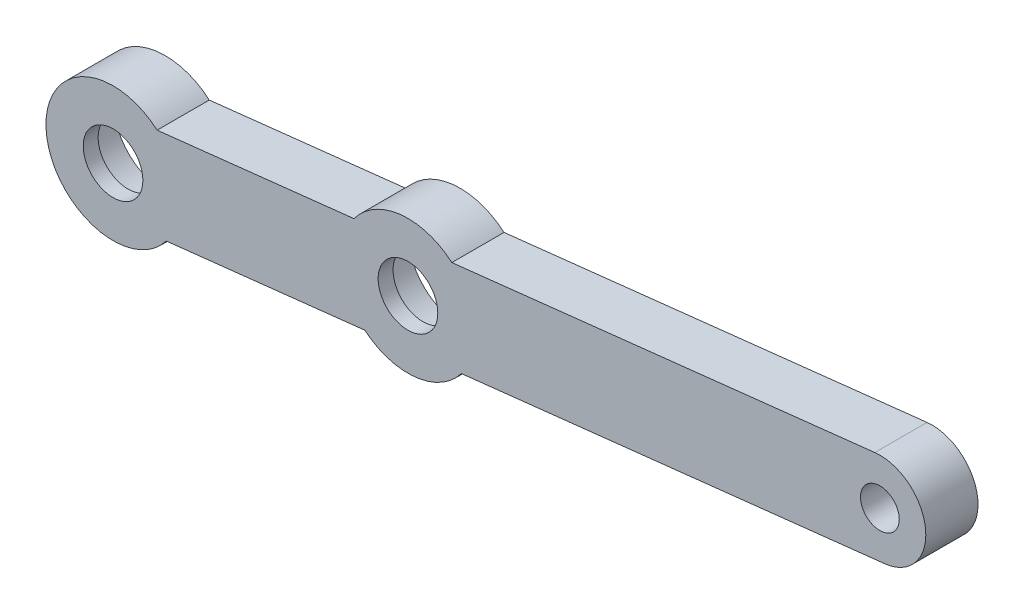
ISO-10303-21;
HEADER;
FILE_DESCRIPTION(('STEP AP214'),'2;1');
FILE_NAME('part.step','',(''),(''),'','','');
FILE_SCHEMA(('AUTOMOTIVE_DESIGN { 1 0 10303 214 1 1 1 1 }'));
ENDSEC;
DATA;
#1=APPLICATION_CONTEXT('core data for automotive mechanical design processes');
#2=APPLICATION_PROTOCOL_DEFINITION('international standard','automotive_design',2000,#1);
#3=PRODUCT_CONTEXT('',#1,'mechanical');
#4=PRODUCT('Part','Part','',(#3));
#5=PRODUCT_RELATED_PRODUCT_CATEGORY('part','',(#4));
#6=PRODUCT_DEFINITION_FORMATION('','',#4);
#7=PRODUCT_DEFINITION_CONTEXT('part definition',#1,'design');
#8=PRODUCT_DEFINITION('design','',#6,#7);
#9=PRODUCT_DEFINITION_SHAPE('','',#8);
#10=(LENGTH_UNIT() NAMED_UNIT(*) SI_UNIT(.MILLI.,.METRE.));
#11=(NAMED_UNIT(*) PLANE_ANGLE_UNIT() SI_UNIT($,.RADIAN.));
#12=(NAMED_UNIT(*) SI_UNIT($,.STERADIAN.) SOLID_ANGLE_UNIT());
#13=UNCERTAINTY_MEASURE_WITH_UNIT(LENGTH_MEASURE(1.E-05),#10,'distance_accuracy_value','');
#14=(GEOMETRIC_REPRESENTATION_CONTEXT(3) GLOBAL_UNCERTAINTY_ASSIGNED_CONTEXT((#13)) GLOBAL_UNIT_ASSIGNED_CONTEXT((#10,
#11,#12)) REPRESENTATION_CONTEXT('',''));
#15=CARTESIAN_POINT('',(0.,0.,0.));
#16=DIRECTION('',(0.,0.,1.));
#17=DIRECTION('',(1.,0.,0.));
#18=AXIS2_PLACEMENT_3D('',#15,#16,#17);
#19=CARTESIAN_POINT('',(-22.1314903893003,-60.2398296240801,0.));
#20=DIRECTION('',(0.,0.,1.));
#21=DIRECTION('',(1.,0.,0.));
#22=AXIS2_PLACEMENT_3D('',#19,#20,#21);
#23=PLANE('',#22);
#24=CARTESIAN_POINT('',(-22.1314903893003,-60.2398296240801,0.));
#25=DIRECTION('',(0.,0.,1.));
#26=DIRECTION('',(1.,0.,0.));
#27=AXIS2_PLACEMENT_3D('',#24,#25,#26);
#28=CIRCLE('',#27,6.16203199369484);
#29=CARTESIAN_POINT('',(-21.4513828570283,-66.3642146573603,0.));
#30=VERTEX_POINT('',#29);
#31=CARTESIAN_POINT('',(-22.811597921572,-54.1154445908,0.));
#32=VERTEX_POINT('',#31);
#33=EDGE_CURVE('E113',#30,#32,#28,.T.);
#34=ORIENTED_EDGE('',*,*,#33,.F.);
#35=DIRECTION('',(0.99389049578886,0.110370659056531,0.));
#36=VECTOR('',#35,1.);
#37=CARTESIAN_POINT('',(-78.2671245077364,-72.6735524338496,0.));
#38=LINE('',#37,#36);
#39=CARTESIAN_POINT('',(-78.2671245077364,-72.6735524338496,0.));
#40=VERTEX_POINT('',#39);
#41=EDGE_CURVE('E58',#40,#30,#38,.T.);
#42=ORIENTED_EDGE('',*,*,#41,.F.);
#43=CARTESIAN_POINT('',(-85.4292496982827,-67.2234182378007,0.));
#44=DIRECTION('',(0.,0.,1.));
#45=DIRECTION('',(1.,0.,0.));
#46=AXIS2_PLACEMENT_3D('',#43,#44,#45);
#47=CIRCLE('',#46,8.99999999999999);
#48=CARTESIAN_POINT('',(-91.2211617740659,-74.1120867961214,0.));
#49=VERTEX_POINT('',#48);
#50=EDGE_CURVE('E66',#49,#40,#47,.T.);
#51=ORIENTED_EDGE('',*,*,#50,.F.);
#52=DIRECTION('',(0.99389049578886,0.110370659056531,0.));
#53=VECTOR('',#52,1.);
#54=CARTESIAN_POINT('',(-117.842377898773,-77.0683492626803,0.));
#55=LINE('',#54,#53);
#56=CARTESIAN_POINT('',(-117.842377898773,-77.0683492626803,0.));
#57=VERTEX_POINT('',#56);
#58=EDGE_CURVE('E174',#57,#49,#55,.T.);
#59=ORIENTED_EDGE('',*,*,#58,.F.);
#60=CARTESIAN_POINT('',(-124.987033060946,-71.5953334017827,0.));
#61=DIRECTION('',(0.,0.,1.));
#62=DIRECTION('',(1.,0.,0.));
#63=AXIS2_PLACEMENT_3D('',#60,#61,#62);
#64=CIRCLE('',#63,8.99999999999999);
#65=CARTESIAN_POINT('',(-119.079141177407,-64.8058699846626,0.));
#66=VERTEX_POINT('',#65);
#67=EDGE_CURVE('E172',#66,#57,#64,.T.);
#68=ORIENTED_EDGE('',*,*,#67,.F.);
#69=DIRECTION('',(-0.99389049578886,-0.110370659056534,0.));
#70=VECTOR('',#69,1.);
#71=CARTESIAN_POINT('',(-92.6659555769549,-61.8727091235251,0.));
#72=LINE('',#71,#70);
#73=CARTESIAN_POINT('',(-92.6659555769549,-61.8727091235251,0.));
#74=VERTEX_POINT('',#73);
#75=EDGE_CURVE('E170',#74,#66,#72,.T.);
#76=ORIENTED_EDGE('',*,*,#75,.F.);
#77=CARTESIAN_POINT('',(-85.4292496982827,-67.2234182378007,0.));
#78=DIRECTION('',(0.,0.,1.));
#79=DIRECTION('',(1.,0.,0.));
#80=AXIS2_PLACEMENT_3D('',#77,#78,#79);
#81=CIRCLE('',#80,8.99999999999999);
#82=CARTESIAN_POINT('',(-79.5427608339336,-60.4153899733255,0.));
#83=VERTEX_POINT('',#82);
#84=EDGE_CURVE('E168',#83,#74,#81,.T.);
#85=ORIENTED_EDGE('',*,*,#84,.F.);
#86=DIRECTION('',(-0.99389049578886,-0.110370659056534,0.));
#87=VECTOR('',#86,1.);
#88=CARTESIAN_POINT('',(-22.811597921572,-54.1154445908,0.));
#89=LINE('',#88,#87);
#90=EDGE_CURVE('E166',#32,#83,#89,.T.);
#91=ORIENTED_EDGE('',*,*,#90,.F.);
#92=EDGE_LOOP('',(#34,#42,#51,#59,#68,#76,#85,#91));
#93=FACE_BOUND('',#92,.T.);
#94=CARTESIAN_POINT('',(-22.1314903893003,-60.2398296240801,0.));
#95=DIRECTION('',(0.,0.,1.));
#96=DIRECTION('',(1.,0.,0.));
#97=AXIS2_PLACEMENT_3D('',#94,#95,#96);
#98=CIRCLE('',#97,2.6);
#99=CARTESIAN_POINT('',(-19.5314903893003,-60.2398296240801,0.));
#100=VERTEX_POINT('',#99);
#101=EDGE_CURVE('E162',#100,#100,#98,.T.);
#102=ORIENTED_EDGE('',*,*,#101,.T.);
#103=EDGE_LOOP('',(#102));
#104=FACE_BOUND('',#103,.T.);
#105=CARTESIAN_POINT('',(-85.4292496982827,-67.2234182378007,0.));
#106=DIRECTION('',(0.,0.,1.));
#107=DIRECTION('',(1.,0.,0.));
#108=AXIS2_PLACEMENT_3D('',#105,#106,#107);
#109=CIRCLE('',#108,6.90000000000001);
#110=CARTESIAN_POINT('',(-78.5292496982827,-67.2234182378007,0.));
#111=VERTEX_POINT('',#110);
#112=EDGE_CURVE('E157',#111,#111,#109,.T.);
#113=ORIENTED_EDGE('',*,*,#112,.T.);
#114=EDGE_LOOP('',(#113));
#115=FACE_BOUND('',#114,.T.);
#116=CARTESIAN_POINT('',(-124.987033060946,-71.5953334017827,0.));
#117=DIRECTION('',(0.,0.,1.));
#118=DIRECTION('',(1.,0.,0.));
#119=AXIS2_PLACEMENT_3D('',#116,#117,#118);
#120=CIRCLE('',#119,6.90000000000001);
#121=CARTESIAN_POINT('',(-118.087033060946,-71.5953334017827,0.));
#122=VERTEX_POINT('',#121);
#123=EDGE_CURVE('E154',#122,#122,#120,.T.);
#124=ORIENTED_EDGE('',*,*,#123,.T.);
#125=EDGE_LOOP('',(#124));
#126=FACE_BOUND('',#125,.T.);
#127=ADVANCED_FACE('F43',(#93,#104,#115,#126),#23,.F.);
#128=CARTESIAN_POINT('',(-22.1314903893003,-60.2398296240801,5.));
#129=DIRECTION('',(0.,0.,-1.));
#130=DIRECTION('',(-1.,0.,0.));
#131=AXIS2_PLACEMENT_3D('',#128,#129,#130);
#132=CYLINDRICAL_SURFACE('',#131,6.16203199369484);
#133=ORIENTED_EDGE('',*,*,#33,.T.);
#134=DIRECTION('',(0.,0.,-1.));
#135=VECTOR('',#134,1.);
#136=CARTESIAN_POINT('',(-22.811597921572,-54.1154445908,5.));
#137=LINE('',#136,#135);
#138=CARTESIAN_POINT('',(-22.811597921572,-54.1154445907999,7.));
#139=VERTEX_POINT('',#138);
#140=EDGE_CURVE('E11',#139,#32,#137,.T.);
#141=ORIENTED_EDGE('',*,*,#140,.F.);
#142=CARTESIAN_POINT('',(-22.1314903893003,-60.2398296240801,7.));
#143=DIRECTION('',(0.,0.,1.));
#144=DIRECTION('',(1.,0.,0.));
#145=AXIS2_PLACEMENT_3D('',#142,#143,#144);
#146=CIRCLE('',#145,6.16203199369484);
#147=CARTESIAN_POINT('',(-21.4513828570284,-66.3642146573602,7.));
#148=VERTEX_POINT('',#147);
#149=EDGE_CURVE('E111',#148,#139,#146,.T.);
#150=ORIENTED_EDGE('',*,*,#149,.F.);
#151=DIRECTION('',(0.,0.,-1.));
#152=VECTOR('',#151,1.);
#153=CARTESIAN_POINT('',(-21.4513828570283,-66.3642146573603,5.));
#154=LINE('',#153,#152);
#155=EDGE_CURVE('E178',#148,#30,#154,.T.);
#156=ORIENTED_EDGE('',*,*,#155,.T.);
#157=EDGE_LOOP('',(#133,#141,#150,#156));
#158=FACE_BOUND('',#157,.T.);
#159=ADVANCED_FACE('F45',(#158),#132,.T.);
#160=CARTESIAN_POINT('',(-22.811597921572,-54.1154445908,5.));
#161=DIRECTION('',(0.110370659056534,-0.99389049578886,0.));
#162=DIRECTION('',(0.99389049578886,0.110370659056534,0.));
#163=AXIS2_PLACEMENT_3D('',#160,#161,#162);
#164=PLANE('',#163);
#165=ORIENTED_EDGE('',*,*,#90,.T.);
#166=DIRECTION('',(0.,0.,-1.));
#167=VECTOR('',#166,1.);
#168=CARTESIAN_POINT('',(-79.5427608339336,-60.4153899733255,5.));
#169=LINE('',#168,#167);
#170=CARTESIAN_POINT('',(-79.5427608339336,-60.4153899733255,7.));
#171=VERTEX_POINT('',#170);
#172=EDGE_CURVE('E51',#171,#83,#169,.T.);
#173=ORIENTED_EDGE('',*,*,#172,.F.);
#174=DIRECTION('',(-0.99389049578886,-0.110370659056536,0.));
#175=VECTOR('',#174,1.);
#176=CARTESIAN_POINT('',(-22.811597921572,-54.1154445907999,7.));
#177=LINE('',#176,#175);
#178=EDGE_CURVE('E116',#139,#171,#177,.T.);
#179=ORIENTED_EDGE('',*,*,#178,.F.);
#180=ORIENTED_EDGE('',*,*,#140,.T.);
#181=EDGE_LOOP('',(#165,#173,#179,#180));
#182=FACE_BOUND('',#181,.T.);
#183=ADVANCED_FACE('F117',(#182),#164,.F.);
#184=CARTESIAN_POINT('',(-85.4292496982827,-67.2234182378007,5.));
#185=DIRECTION('',(0.,0.,-1.));
#186=DIRECTION('',(-1.,0.,0.));
#187=AXIS2_PLACEMENT_3D('',#184,#185,#186);
#188=CYLINDRICAL_SURFACE('',#187,8.99999999999999);
#189=ORIENTED_EDGE('',*,*,#84,.T.);
#190=DIRECTION('',(0.,0.,-1.));
#191=VECTOR('',#190,1.);
#192=CARTESIAN_POINT('',(-92.6659555769549,-61.8727091235251,5.));
#193=LINE('',#192,#191);
#194=CARTESIAN_POINT('',(-92.6659555769549,-61.8727091235251,7.));
#195=VERTEX_POINT('',#194);
#196=EDGE_CURVE('E190',#195,#74,#193,.T.);
#197=ORIENTED_EDGE('',*,*,#196,.F.);
#198=CARTESIAN_POINT('',(-85.4292496982827,-67.2234182378007,7.));
#199=DIRECTION('',(0.,0.,1.));
#200=DIRECTION('',(1.,0.,0.));
#201=AXIS2_PLACEMENT_3D('',#198,#199,#200);
#202=CIRCLE('',#201,8.99999999999999);
#203=EDGE_CURVE('E122',#171,#195,#202,.T.);
#204=ORIENTED_EDGE('',*,*,#203,.F.);
#205=ORIENTED_EDGE('',*,*,#172,.T.);
#206=EDGE_LOOP('',(#189,#197,#204,#205));
#207=FACE_BOUND('',#206,.T.);
#208=ADVANCED_FACE('F194',(#207),#188,.T.);
#209=CARTESIAN_POINT('',(-92.6659555769549,-61.8727091235251,5.));
#210=DIRECTION('',(0.110370659056534,-0.99389049578886,0.));
#211=DIRECTION('',(0.99389049578886,0.110370659056534,0.));
#212=AXIS2_PLACEMENT_3D('',#209,#210,#211);
#213=PLANE('',#212);
#214=ORIENTED_EDGE('',*,*,#75,.T.);
#215=DIRECTION('',(0.,0.,-1.));
#216=VECTOR('',#215,1.);
#217=CARTESIAN_POINT('',(-119.079141177407,-64.8058699846626,5.));
#218=LINE('',#217,#216);
#219=CARTESIAN_POINT('',(-119.079141177407,-64.8058699846626,7.));
#220=VERTEX_POINT('',#219);
#221=EDGE_CURVE('E187',#220,#66,#218,.T.);
#222=ORIENTED_EDGE('',*,*,#221,.F.);
#223=DIRECTION('',(-0.99389049578886,-0.110370659056534,0.));
#224=VECTOR('',#223,1.);
#225=CARTESIAN_POINT('',(-92.6659555769549,-61.8727091235251,7.));
#226=LINE('',#225,#224);
#227=EDGE_CURVE('E138',#195,#220,#226,.T.);
#228=ORIENTED_EDGE('',*,*,#227,.F.);
#229=ORIENTED_EDGE('',*,*,#196,.T.);
#230=EDGE_LOOP('',(#214,#222,#228,#229));
#231=FACE_BOUND('',#230,.T.);
#232=ADVANCED_FACE('F201',(#231),#213,.F.);
#233=CARTESIAN_POINT('',(-124.987033060946,-71.5953334017827,5.));
#234=DIRECTION('',(0.,0.,-1.));
#235=DIRECTION('',(-1.,0.,0.));
#236=AXIS2_PLACEMENT_3D('',#233,#234,#235);
#237=CYLINDRICAL_SURFACE('',#236,8.99999999999999);
#238=ORIENTED_EDGE('',*,*,#67,.T.);
#239=DIRECTION('',(0.,0.,-1.));
#240=VECTOR('',#239,1.);
#241=CARTESIAN_POINT('',(-117.842377898773,-77.0683492626803,5.));
#242=LINE('',#241,#240);
#243=CARTESIAN_POINT('',(-117.842377898773,-77.0683492626803,7.));
#244=VERTEX_POINT('',#243);
#245=EDGE_CURVE('E184',#244,#57,#242,.T.);
#246=ORIENTED_EDGE('',*,*,#245,.F.);
#247=CARTESIAN_POINT('',(-124.987033060946,-71.5953334017827,7.));
#248=DIRECTION('',(0.,0.,1.));
#249=DIRECTION('',(1.,0.,0.));
#250=AXIS2_PLACEMENT_3D('',#247,#248,#249);
#251=CIRCLE('',#250,8.99999999999999);
#252=EDGE_CURVE('E141',#220,#244,#251,.T.);
#253=ORIENTED_EDGE('',*,*,#252,.F.);
#254=ORIENTED_EDGE('',*,*,#221,.T.);
#255=EDGE_LOOP('',(#238,#246,#253,#254));
#256=FACE_BOUND('',#255,.T.);
#257=ADVANCED_FACE('F205',(#256),#237,.T.);
#258=CARTESIAN_POINT('',(-117.842377898773,-77.0683492626803,5.));
#259=DIRECTION('',(-0.110370659056531,0.993890495788861,0.));
#260=DIRECTION('',(-0.993890495788861,-0.110370659056531,0.));
#261=AXIS2_PLACEMENT_3D('',#258,#259,#260);
#262=PLANE('',#261);
#263=ORIENTED_EDGE('',*,*,#58,.T.);
#264=DIRECTION('',(0.,0.,-1.));
#265=VECTOR('',#264,1.);
#266=CARTESIAN_POINT('',(-91.2211617740659,-74.1120867961214,5.));
#267=LINE('',#266,#265);
#268=CARTESIAN_POINT('',(-91.2211617740659,-74.1120867961214,7.));
#269=VERTEX_POINT('',#268);
#270=EDGE_CURVE('E182',#269,#49,#267,.T.);
#271=ORIENTED_EDGE('',*,*,#270,.F.);
#272=DIRECTION('',(0.99389049578886,0.110370659056531,0.));
#273=VECTOR('',#272,1.);
#274=CARTESIAN_POINT('',(-117.842377898773,-77.0683492626803,7.));
#275=LINE('',#274,#273);
#276=EDGE_CURVE('E144',#244,#269,#275,.T.);
#277=ORIENTED_EDGE('',*,*,#276,.F.);
#278=ORIENTED_EDGE('',*,*,#245,.T.);
#279=EDGE_LOOP('',(#263,#271,#277,#278));
#280=FACE_BOUND('',#279,.T.);
#281=ADVANCED_FACE('F209',(#280),#262,.F.);
#282=CARTESIAN_POINT('',(-85.4292496982827,-67.2234182378007,5.));
#283=DIRECTION('',(0.,0.,-1.));
#284=DIRECTION('',(-1.,0.,0.));
#285=AXIS2_PLACEMENT_3D('',#282,#283,#284);
#286=CYLINDRICAL_SURFACE('',#285,8.99999999999999);
#287=ORIENTED_EDGE('',*,*,#50,.T.);
#288=DIRECTION('',(0.,0.,-1.));
#289=VECTOR('',#288,1.);
#290=CARTESIAN_POINT('',(-78.2671245077364,-72.6735524338496,5.));
#291=LINE('',#290,#289);
#292=CARTESIAN_POINT('',(-78.2671245077364,-72.6735524338496,7.));
#293=VERTEX_POINT('',#292);
#294=EDGE_CURVE('E180',#293,#40,#291,.T.);
#295=ORIENTED_EDGE('',*,*,#294,.F.);
#296=CARTESIAN_POINT('',(-85.4292496982827,-67.2234182378007,7.));
#297=DIRECTION('',(0.,0.,1.));
#298=DIRECTION('',(1.,0.,0.));
#299=AXIS2_PLACEMENT_3D('',#296,#297,#298);
#300=CIRCLE('',#299,8.99999999999999);
#301=EDGE_CURVE('E147',#269,#293,#300,.T.);
#302=ORIENTED_EDGE('',*,*,#301,.F.);
#303=ORIENTED_EDGE('',*,*,#270,.T.);
#304=EDGE_LOOP('',(#287,#295,#302,#303));
#305=FACE_BOUND('',#304,.T.);
#306=ADVANCED_FACE('F210',(#305),#286,.T.);
#307=CARTESIAN_POINT('',(-78.2671245077364,-72.6735524338496,5.));
#308=DIRECTION('',(-0.110370659056531,0.993890495788861,0.));
#309=DIRECTION('',(-0.993890495788861,-0.110370659056531,0.));
#310=AXIS2_PLACEMENT_3D('',#307,#308,#309);
#311=PLANE('',#310);
#312=ORIENTED_EDGE('',*,*,#41,.T.);
#313=ORIENTED_EDGE('',*,*,#155,.F.);
#314=DIRECTION('',(0.99389049578886,0.110370659056533,0.));
#315=VECTOR('',#314,1.);
#316=CARTESIAN_POINT('',(-78.2671245077364,-72.6735524338496,7.));
#317=LINE('',#316,#315);
#318=EDGE_CURVE('E129',#293,#148,#317,.T.);
#319=ORIENTED_EDGE('',*,*,#318,.F.);
#320=ORIENTED_EDGE('',*,*,#294,.T.);
#321=EDGE_LOOP('',(#312,#313,#319,#320));
#322=FACE_BOUND('',#321,.T.);
#323=ADVANCED_FACE('F211',(#322),#311,.F.);
#324=CARTESIAN_POINT('',(-22.1314903893003,-60.2398296240801,5.));
#325=DIRECTION('',(0.,0.,-1.));
#326=DIRECTION('',(-1.,0.,0.));
#327=AXIS2_PLACEMENT_3D('',#324,#325,#326);
#328=CYLINDRICAL_SURFACE('',#327,2.6);
#329=ORIENTED_EDGE('',*,*,#101,.F.);
#330=EDGE_LOOP('',(#329));
#331=FACE_BOUND('',#330,.T.);
#332=CARTESIAN_POINT('',(-22.1314903893003,-60.2398296240801,7.));
#333=DIRECTION('',(0.,0.,1.));
#334=DIRECTION('',(1.,0.,0.));
#335=AXIS2_PLACEMENT_3D('',#332,#333,#334);
#336=CIRCLE('',#335,2.6);
#337=CARTESIAN_POINT('',(-19.5314903893003,-60.2398296240801,7.));
#338=VERTEX_POINT('',#337);
#339=EDGE_CURVE('E130',#338,#338,#336,.T.);
#340=ORIENTED_EDGE('',*,*,#339,.T.);
#341=EDGE_LOOP('',(#340));
#342=FACE_BOUND('',#341,.T.);
#343=ADVANCED_FACE('F213',(#331,#342),#328,.F.);
#344=CARTESIAN_POINT('',(-85.4292496982827,-67.2234182378007,5.));
#345=DIRECTION('',(0.,0.,-1.));
#346=DIRECTION('',(-1.,0.,0.));
#347=AXIS2_PLACEMENT_3D('',#344,#345,#346);
#348=CYLINDRICAL_SURFACE('',#347,6.90000000000001);
#349=CARTESIAN_POINT('',(-85.4292496982827,-67.2234182378007,5.));
#350=DIRECTION('',(0.,0.,1.));
#351=DIRECTION('',(1.,0.,0.));
#352=AXIS2_PLACEMENT_3D('',#349,#350,#351);
#353=CIRCLE('',#352,6.90000000000001);
#354=CARTESIAN_POINT('',(-78.5292496982827,-67.2234182378007,5.));
#355=VERTEX_POINT('',#354);
#356=EDGE_CURVE('E153',#355,#355,#353,.T.);
#357=ORIENTED_EDGE('',*,*,#356,.T.);
#358=EDGE_LOOP('',(#357));
#359=FACE_BOUND('',#358,.T.);
#360=ORIENTED_EDGE('',*,*,#112,.F.);
#361=EDGE_LOOP('',(#360));
#362=FACE_BOUND('',#361,.T.);
#363=ADVANCED_FACE('F219',(#359,#362),#348,.F.);
#364=CARTESIAN_POINT('',(-124.987033060946,-71.5953334017827,5.));
#365=DIRECTION('',(0.,0.,-1.));
#366=DIRECTION('',(-1.,0.,0.));
#367=AXIS2_PLACEMENT_3D('',#364,#365,#366);
#368=CYLINDRICAL_SURFACE('',#367,6.90000000000001);
#369=CARTESIAN_POINT('',(-124.987033060946,-71.5953334017827,5.));
#370=DIRECTION('',(0.,0.,1.));
#371=DIRECTION('',(1.,0.,0.));
#372=AXIS2_PLACEMENT_3D('',#369,#370,#371);
#373=CIRCLE('',#372,6.90000000000001);
#374=CARTESIAN_POINT('',(-118.087033060946,-71.5953334017827,5.));
#375=VERTEX_POINT('',#374);
#376=EDGE_CURVE('E150',#375,#375,#373,.T.);
#377=ORIENTED_EDGE('',*,*,#376,.T.);
#378=EDGE_LOOP('',(#377));
#379=FACE_BOUND('',#378,.T.);
#380=ORIENTED_EDGE('',*,*,#123,.F.);
#381=EDGE_LOOP('',(#380));
#382=FACE_BOUND('',#381,.T.);
#383=ADVANCED_FACE('F231',(#379,#382),#368,.F.);
#384=CARTESIAN_POINT('',(-22.1314903893003,-60.2398296240801,5.));
#385=DIRECTION('',(0.,0.,1.));
#386=DIRECTION('',(1.,0.,0.));
#387=AXIS2_PLACEMENT_3D('',#384,#385,#386);
#388=PLANE('',#387);
#389=CARTESIAN_POINT('',(-85.4292496982597,-67.2234182376666,5.));
#390=DIRECTION('',(0.,0.,1.));
#391=DIRECTION('',(1.,0.,0.));
#392=AXIS2_PLACEMENT_3D('',#389,#390,#391);
#393=CIRCLE('',#392,4.00000000000001);
#394=CARTESIAN_POINT('',(-81.4292496982597,-67.2234182376666,5.));
#395=VERTEX_POINT('',#394);
#396=EDGE_CURVE('E262',#395,#395,#393,.T.);
#397=ORIENTED_EDGE('',*,*,#396,.T.);
#398=EDGE_LOOP('',(#397));
#399=FACE_BOUND('',#398,.T.);
#400=ORIENTED_EDGE('',*,*,#356,.F.);
#401=EDGE_LOOP('',(#400));
#402=FACE_BOUND('',#401,.T.);
#403=ADVANCED_FACE('F235',(#399,#402),#388,.F.);
#404=CARTESIAN_POINT('',(-124.987033060946,-71.5953334017827,5.));
#405=DIRECTION('',(0.,0.,1.));
#406=DIRECTION('',(1.,0.,0.));
#407=AXIS2_PLACEMENT_3D('',#404,#405,#406);
#408=CIRCLE('',#407,4.00000000000001);
#409=CARTESIAN_POINT('',(-120.987033060946,-71.5953334017827,5.));
#410=VERTEX_POINT('',#409);
#411=EDGE_CURVE('E259',#410,#410,#408,.T.);
#412=ORIENTED_EDGE('',*,*,#411,.T.);
#413=EDGE_LOOP('',(#412));
#414=FACE_BOUND('',#413,.T.);
#415=ORIENTED_EDGE('',*,*,#376,.F.);
#416=EDGE_LOOP('',(#415));
#417=FACE_BOUND('',#416,.T.);
#418=ADVANCED_FACE('F239',(#414,#417),#388,.F.);
#419=CARTESIAN_POINT('',(-22.1314903893003,-60.2398296240801,7.));
#420=DIRECTION('',(0.,0.,1.));
#421=DIRECTION('',(1.,0.,0.));
#422=AXIS2_PLACEMENT_3D('',#419,#420,#421);
#423=PLANE('',#422);
#424=CARTESIAN_POINT('',(-85.4292496982597,-67.2234182376666,7.));
#425=DIRECTION('',(0.,0.,1.));
#426=DIRECTION('',(1.,0.,0.));
#427=AXIS2_PLACEMENT_3D('',#424,#425,#426);
#428=CIRCLE('',#427,4.00000000000001);
#429=CARTESIAN_POINT('',(-81.4292496982597,-67.2234182376666,7.));
#430=VERTEX_POINT('',#429);
#431=EDGE_CURVE('E133',#430,#430,#428,.T.);
#432=ORIENTED_EDGE('',*,*,#431,.F.);
#433=EDGE_LOOP('',(#432));
#434=FACE_BOUND('',#433,.T.);
#435=ORIENTED_EDGE('',*,*,#149,.T.);
#436=ORIENTED_EDGE('',*,*,#178,.T.);
#437=ORIENTED_EDGE('',*,*,#203,.T.);
#438=ORIENTED_EDGE('',*,*,#227,.T.);
#439=ORIENTED_EDGE('',*,*,#252,.T.);
#440=ORIENTED_EDGE('',*,*,#276,.T.);
#441=ORIENTED_EDGE('',*,*,#301,.T.);
#442=ORIENTED_EDGE('',*,*,#318,.T.);
#443=EDGE_LOOP('',(#435,#436,#437,#438,#439,#440,#441,#442));
#444=FACE_BOUND('',#443,.T.);
#445=ORIENTED_EDGE('',*,*,#339,.F.);
#446=EDGE_LOOP('',(#445));
#447=FACE_BOUND('',#446,.T.);
#448=CARTESIAN_POINT('',(-124.987033060946,-71.5953334017827,7.));
#449=DIRECTION('',(0.,0.,1.));
#450=DIRECTION('',(1.,0.,0.));
#451=AXIS2_PLACEMENT_3D('',#448,#449,#450);
#452=CIRCLE('',#451,4.00000000000001);
#453=CARTESIAN_POINT('',(-120.987033060946,-71.5953334017827,7.));
#454=VERTEX_POINT('',#453);
#455=EDGE_CURVE('E256',#454,#454,#452,.T.);
#456=ORIENTED_EDGE('',*,*,#455,.F.);
#457=EDGE_LOOP('',(#456));
#458=FACE_BOUND('',#457,.T.);
#459=ADVANCED_FACE('F125',(#434,#444,#447,#458),#423,.T.);
#460=CARTESIAN_POINT('',(-85.4292496982597,-67.2234182376666,7.));
#461=DIRECTION('',(0.,0.,-1.));
#462=DIRECTION('',(-1.,0.,0.));
#463=AXIS2_PLACEMENT_3D('',#460,#461,#462);
#464=CYLINDRICAL_SURFACE('',#463,4.00000000000001);
#465=ORIENTED_EDGE('',*,*,#431,.T.);
#466=EDGE_LOOP('',(#465));
#467=FACE_BOUND('',#466,.T.);
#468=ORIENTED_EDGE('',*,*,#396,.F.);
#469=EDGE_LOOP('',(#468));
#470=FACE_BOUND('',#469,.T.);
#471=ADVANCED_FACE('F243',(#467,#470),#464,.F.);
#472=CARTESIAN_POINT('',(-124.987033060946,-71.5953334017827,7.));
#473=DIRECTION('',(0.,0.,-1.));
#474=DIRECTION('',(-1.,0.,0.));
#475=AXIS2_PLACEMENT_3D('',#472,#473,#474);
#476=CYLINDRICAL_SURFACE('',#475,4.00000000000001);
#477=ORIENTED_EDGE('',*,*,#455,.T.);
#478=EDGE_LOOP('',(#477));
#479=FACE_BOUND('',#478,.T.);
#480=ORIENTED_EDGE('',*,*,#411,.F.);
#481=EDGE_LOOP('',(#480));
#482=FACE_BOUND('',#481,.T.);
#483=ADVANCED_FACE('F247',(#479,#482),#476,.F.);
#484=CLOSED_SHELL('',(#127,#159,#183,#208,#232,#257,#281,#306,#323,#343,#363,#383,#403,#418,
#459,#471,#483));
#485=MANIFOLD_SOLID_BREP('B2',#484);
#486=ADVANCED_BREP_SHAPE_REPRESENTATION('',(#18,#485),#14);
#487=SHAPE_DEFINITION_REPRESENTATION(#9,#486);
ENDSEC;
END-ISO-10303-21;
